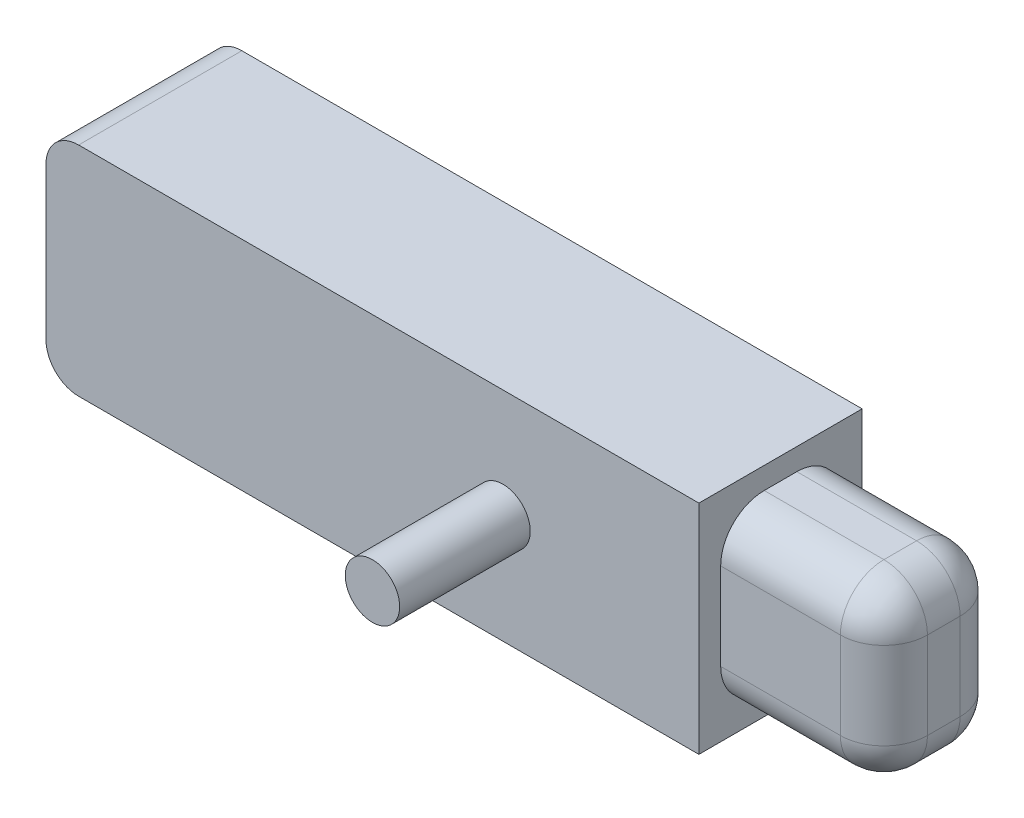
ISO-10303-21;
HEADER;
FILE_DESCRIPTION(('STEP AP214'),'2;1');
FILE_NAME('part.step','',(''),(''),'','','');
FILE_SCHEMA(('AUTOMOTIVE_DESIGN { 1 0 10303 214 1 1 1 1 }'));
ENDSEC;
DATA;
#1=APPLICATION_CONTEXT('core data for automotive mechanical design processes');
#2=APPLICATION_PROTOCOL_DEFINITION('international standard','automotive_design',2000,#1);
#3=PRODUCT_CONTEXT('',#1,'mechanical');
#4=PRODUCT('Part','Part','',(#3));
#5=PRODUCT_RELATED_PRODUCT_CATEGORY('part','',(#4));
#6=PRODUCT_DEFINITION_FORMATION('','',#4);
#7=PRODUCT_DEFINITION_CONTEXT('part definition',#1,'design');
#8=PRODUCT_DEFINITION('design','',#6,#7);
#9=PRODUCT_DEFINITION_SHAPE('','',#8);
#10=(LENGTH_UNIT() NAMED_UNIT(*) SI_UNIT(.MILLI.,.METRE.));
#11=(NAMED_UNIT(*) PLANE_ANGLE_UNIT() SI_UNIT($,.RADIAN.));
#12=(NAMED_UNIT(*) SI_UNIT($,.STERADIAN.) SOLID_ANGLE_UNIT());
#13=UNCERTAINTY_MEASURE_WITH_UNIT(LENGTH_MEASURE(1.E-05),#10,'distance_accuracy_value','');
#14=(GEOMETRIC_REPRESENTATION_CONTEXT(3) GLOBAL_UNCERTAINTY_ASSIGNED_CONTEXT((#13)) GLOBAL_UNIT_ASSIGNED_CONTEXT((#10,
#11,#12)) REPRESENTATION_CONTEXT('',''));
#15=CARTESIAN_POINT('',(0.,0.,0.));
#16=DIRECTION('',(0.,0.,1.));
#17=DIRECTION('',(1.,0.,0.));
#18=AXIS2_PLACEMENT_3D('',#15,#16,#17);
#19=CARTESIAN_POINT('',(30.,20.,7.5));
#20=DIRECTION('',(-1.,0.,0.));
#21=DIRECTION('',(0.,0.,1.));
#22=AXIS2_PLACEMENT_3D('',#19,#20,#21);
#23=PLANE('',#22);
#24=DIRECTION('',(0.,0.,-1.));
#25=VECTOR('',#24,1.);
#26=CARTESIAN_POINT('',(30.,0.,7.5));
#27=LINE('',#26,#25);
#28=CARTESIAN_POINT('',(30.,0.,7.5));
#29=VERTEX_POINT('',#28);
#30=CARTESIAN_POINT('',(30.,0.,-7.5));
#31=VERTEX_POINT('',#30);
#32=EDGE_CURVE('E186',#29,#31,#27,.T.);
#33=ORIENTED_EDGE('',*,*,#32,.T.);
#34=DIRECTION('',(0.,-1.,0.));
#35=VECTOR('',#34,1.);
#36=CARTESIAN_POINT('',(30.,20.,-7.5));
#37=LINE('',#36,#35);
#38=CARTESIAN_POINT('',(30.,20.,-7.5));
#39=VERTEX_POINT('',#38);
#40=EDGE_CURVE('E174',#39,#31,#37,.T.);
#41=ORIENTED_EDGE('',*,*,#40,.F.);
#42=DIRECTION('',(0.,0.,-1.));
#43=VECTOR('',#42,1.);
#44=CARTESIAN_POINT('',(30.,20.,7.5));
#45=LINE('',#44,#43);
#46=CARTESIAN_POINT('',(30.,20.,7.5));
#47=VERTEX_POINT('',#46);
#48=EDGE_CURVE('E160',#47,#39,#45,.T.);
#49=ORIENTED_EDGE('',*,*,#48,.F.);
#50=DIRECTION('',(0.,-1.,0.));
#51=VECTOR('',#50,1.);
#52=CARTESIAN_POINT('',(30.,20.,7.5));
#53=LINE('',#52,#51);
#54=EDGE_CURVE('E168',#47,#29,#53,.T.);
#55=ORIENTED_EDGE('',*,*,#54,.T.);
#56=EDGE_LOOP('',(#33,#41,#49,#55));
#57=FACE_BOUND('',#56,.T.);
#58=DIRECTION('',(0.,-1.,0.));
#59=VECTOR('',#58,1.);
#60=CARTESIAN_POINT('',(30.,2.,5.5));
#61=LINE('',#60,#59);
#62=CARTESIAN_POINT('',(30.,14.,5.5));
#63=VERTEX_POINT('',#62);
#64=CARTESIAN_POINT('',(30.,6.,5.5));
#65=VERTEX_POINT('',#64);
#66=EDGE_CURVE('E273',#63,#65,#61,.T.);
#67=ORIENTED_EDGE('',*,*,#66,.F.);
#68=CARTESIAN_POINT('',(30.,14.,1.5));
#69=DIRECTION('',(-1.,0.,0.));
#70=DIRECTION('',(0.,0.,1.));
#71=AXIS2_PLACEMENT_3D('',#68,#69,#70);
#72=CIRCLE('',#71,4.);
#73=CARTESIAN_POINT('',(30.,18.,1.5));
#74=VERTEX_POINT('',#73);
#75=EDGE_CURVE('E217',#63,#74,#72,.T.);
#76=ORIENTED_EDGE('',*,*,#75,.T.);
#77=DIRECTION('',(0.,0.,1.));
#78=VECTOR('',#77,1.);
#79=CARTESIAN_POINT('',(30.,18.,-5.5));
#80=LINE('',#79,#78);
#81=CARTESIAN_POINT('',(30.,18.,-1.5));
#82=VERTEX_POINT('',#81);
#83=EDGE_CURVE('E586',#82,#74,#80,.T.);
#84=ORIENTED_EDGE('',*,*,#83,.F.);
#85=CARTESIAN_POINT('',(30.,14.,-1.5));
#86=DIRECTION('',(-1.,0.,0.));
#87=DIRECTION('',(0.,0.,1.));
#88=AXIS2_PLACEMENT_3D('',#85,#86,#87);
#89=CIRCLE('',#88,4.);
#90=CARTESIAN_POINT('',(30.,14.,-5.5));
#91=VERTEX_POINT('',#90);
#92=EDGE_CURVE('E219',#82,#91,#89,.T.);
#93=ORIENTED_EDGE('',*,*,#92,.T.);
#94=DIRECTION('',(0.,1.,0.));
#95=VECTOR('',#94,1.);
#96=CARTESIAN_POINT('',(30.,2.,-5.5));
#97=LINE('',#96,#95);
#98=CARTESIAN_POINT('',(30.,6.,-5.5));
#99=VERTEX_POINT('',#98);
#100=EDGE_CURVE('E588',#99,#91,#97,.T.);
#101=ORIENTED_EDGE('',*,*,#100,.F.);
#102=CARTESIAN_POINT('',(30.,6.,-1.5));
#103=DIRECTION('',(-1.,0.,0.));
#104=DIRECTION('',(0.,0.,1.));
#105=AXIS2_PLACEMENT_3D('',#102,#103,#104);
#106=CIRCLE('',#105,4.);
#107=CARTESIAN_POINT('',(30.,2.,-1.5));
#108=VERTEX_POINT('',#107);
#109=EDGE_CURVE('E221',#99,#108,#106,.T.);
#110=ORIENTED_EDGE('',*,*,#109,.T.);
#111=DIRECTION('',(0.,0.,-1.));
#112=VECTOR('',#111,1.);
#113=CARTESIAN_POINT('',(30.,2.,-5.5));
#114=LINE('',#113,#112);
#115=CARTESIAN_POINT('',(30.,2.,1.5));
#116=VERTEX_POINT('',#115);
#117=EDGE_CURVE('E593',#116,#108,#114,.T.);
#118=ORIENTED_EDGE('',*,*,#117,.F.);
#119=CARTESIAN_POINT('',(30.,6.,1.5));
#120=DIRECTION('',(-1.,0.,0.));
#121=DIRECTION('',(0.,0.,1.));
#122=AXIS2_PLACEMENT_3D('',#119,#120,#121);
#123=CIRCLE('',#122,4.);
#124=EDGE_CURVE('E223',#116,#65,#123,.T.);
#125=ORIENTED_EDGE('',*,*,#124,.T.);
#126=EDGE_LOOP('',(#67,#76,#84,#93,#101,#110,#118,#125));
#127=FACE_BOUND('',#126,.T.);
#128=ADVANCED_FACE('F41',(#57,#127),#23,.F.);
#129=CARTESIAN_POINT('',(-30.,20.,7.5));
#130=DIRECTION('',(1.,0.,0.));
#131=DIRECTION('',(0.,0.,-1.));
#132=AXIS2_PLACEMENT_3D('',#129,#130,#131);
#133=PLANE('',#132);
#134=DIRECTION('',(0.,-1.,0.));
#135=VECTOR('',#134,1.);
#136=CARTESIAN_POINT('',(-30.,20.,7.5));
#137=LINE('',#136,#135);
#138=CARTESIAN_POINT('',(-30.,17.,7.5));
#139=VERTEX_POINT('',#138);
#140=CARTESIAN_POINT('',(-30.,3.,7.5));
#141=VERTEX_POINT('',#140);
#142=EDGE_CURVE('E173',#139,#141,#137,.T.);
#143=ORIENTED_EDGE('',*,*,#142,.F.);
#144=DIRECTION('',(0.,0.,1.));
#145=VECTOR('',#144,1.);
#146=CARTESIAN_POINT('',(-30.,17.,-7.5));
#147=LINE('',#146,#145);
#148=CARTESIAN_POINT('',(-30.,17.,-7.5));
#149=VERTEX_POINT('',#148);
#150=EDGE_CURVE('E282',#139,#149,#147,.F.);
#151=ORIENTED_EDGE('',*,*,#150,.T.);
#152=DIRECTION('',(0.,-1.,0.));
#153=VECTOR('',#152,1.);
#154=CARTESIAN_POINT('',(-30.,20.,-7.5));
#155=LINE('',#154,#153);
#156=CARTESIAN_POINT('',(-30.,3.,-7.5));
#157=VERTEX_POINT('',#156);
#158=EDGE_CURVE('E181',#149,#157,#155,.T.);
#159=ORIENTED_EDGE('',*,*,#158,.T.);
#160=DIRECTION('',(0.,0.,1.));
#161=VECTOR('',#160,1.);
#162=CARTESIAN_POINT('',(-30.,3.,7.5));
#163=LINE('',#162,#161);
#164=EDGE_CURVE('E279',#157,#141,#163,.T.);
#165=ORIENTED_EDGE('',*,*,#164,.T.);
#166=EDGE_LOOP('',(#143,#151,#159,#165));
#167=FACE_BOUND('',#166,.T.);
#168=ADVANCED_FACE('F291',(#167),#133,.F.);
#169=CARTESIAN_POINT('',(30.,20.,7.5));
#170=DIRECTION('',(0.,0.,-1.));
#171=DIRECTION('',(-1.,0.,0.));
#172=AXIS2_PLACEMENT_3D('',#169,#170,#171);
#173=PLANE('',#172);
#174=CARTESIAN_POINT('',(12.,10.,7.5));
#175=DIRECTION('',(0.,0.,-1.));
#176=DIRECTION('',(-1.,0.,0.));
#177=AXIS2_PLACEMENT_3D('',#174,#175,#176);
#178=CIRCLE('',#177,2.5);
#179=CARTESIAN_POINT('',(9.5,10.,7.5));
#180=VERTEX_POINT('',#179);
#181=EDGE_CURVE('E194',#180,#180,#178,.F.);
#182=ORIENTED_EDGE('',*,*,#181,.F.);
#183=EDGE_LOOP('',(#182));
#184=FACE_BOUND('',#183,.T.);
#185=DIRECTION('',(1.,0.,0.));
#186=VECTOR('',#185,1.);
#187=CARTESIAN_POINT('',(30.,20.,7.5));
#188=LINE('',#187,#186);
#189=CARTESIAN_POINT('',(-27.,20.,7.5));
#190=VERTEX_POINT('',#189);
#191=EDGE_CURVE('E155',#190,#47,#188,.T.);
#192=ORIENTED_EDGE('',*,*,#191,.F.);
#193=CARTESIAN_POINT('',(-27.,17.,7.5));
#194=DIRECTION('',(0.,0.,-1.));
#195=DIRECTION('',(-1.,0.,0.));
#196=AXIS2_PLACEMENT_3D('',#193,#194,#195);
#197=CIRCLE('',#196,3.);
#198=EDGE_CURVE('E277',#190,#139,#197,.F.);
#199=ORIENTED_EDGE('',*,*,#198,.T.);
#200=ORIENTED_EDGE('',*,*,#142,.T.);
#201=CARTESIAN_POINT('',(-27.,3.,7.5));
#202=DIRECTION('',(0.,0.,-1.));
#203=DIRECTION('',(-1.,0.,0.));
#204=AXIS2_PLACEMENT_3D('',#201,#202,#203);
#205=CIRCLE('',#204,3.);
#206=CARTESIAN_POINT('',(-27.,0.,7.5));
#207=VERTEX_POINT('',#206);
#208=EDGE_CURVE('E275',#141,#207,#205,.F.);
#209=ORIENTED_EDGE('',*,*,#208,.T.);
#210=DIRECTION('',(1.,0.,0.));
#211=VECTOR('',#210,1.);
#212=CARTESIAN_POINT('',(30.,0.,7.5));
#213=LINE('',#212,#211);
#214=EDGE_CURVE('E170',#207,#29,#213,.T.);
#215=ORIENTED_EDGE('',*,*,#214,.T.);
#216=ORIENTED_EDGE('',*,*,#54,.F.);
#217=EDGE_LOOP('',(#192,#199,#200,#209,#215,#216));
#218=FACE_BOUND('',#217,.T.);
#219=ADVANCED_FACE('F169',(#184,#218),#173,.F.);
#220=CARTESIAN_POINT('',(30.,20.,-7.5));
#221=DIRECTION('',(0.,0.,1.));
#222=DIRECTION('',(1.,0.,0.));
#223=AXIS2_PLACEMENT_3D('',#220,#221,#222);
#224=PLANE('',#223);
#225=ORIENTED_EDGE('',*,*,#158,.F.);
#226=CARTESIAN_POINT('',(-27.,17.,-7.5));
#227=DIRECTION('',(0.,0.,1.));
#228=DIRECTION('',(1.,0.,0.));
#229=AXIS2_PLACEMENT_3D('',#226,#227,#228);
#230=CIRCLE('',#229,3.);
#231=CARTESIAN_POINT('',(-27.,20.,-7.5));
#232=VERTEX_POINT('',#231);
#233=EDGE_CURVE('E49',#149,#232,#230,.F.);
#234=ORIENTED_EDGE('',*,*,#233,.T.);
#235=DIRECTION('',(-1.,0.,0.));
#236=VECTOR('',#235,1.);
#237=CARTESIAN_POINT('',(30.,20.,-7.5));
#238=LINE('',#237,#236);
#239=EDGE_CURVE('E179',#39,#232,#238,.T.);
#240=ORIENTED_EDGE('',*,*,#239,.F.);
#241=ORIENTED_EDGE('',*,*,#40,.T.);
#242=DIRECTION('',(-1.,0.,0.));
#243=VECTOR('',#242,1.);
#244=CARTESIAN_POINT('',(30.,0.,-7.5));
#245=LINE('',#244,#243);
#246=CARTESIAN_POINT('',(-27.,0.,-7.5));
#247=VERTEX_POINT('',#246);
#248=EDGE_CURVE('E165',#31,#247,#245,.T.);
#249=ORIENTED_EDGE('',*,*,#248,.T.);
#250=CARTESIAN_POINT('',(-27.,3.,-7.5));
#251=DIRECTION('',(0.,0.,1.));
#252=DIRECTION('',(1.,0.,0.));
#253=AXIS2_PLACEMENT_3D('',#250,#251,#252);
#254=CIRCLE('',#253,3.);
#255=EDGE_CURVE('E61',#247,#157,#254,.F.);
#256=ORIENTED_EDGE('',*,*,#255,.T.);
#257=EDGE_LOOP('',(#225,#234,#240,#241,#249,#256));
#258=FACE_BOUND('',#257,.T.);
#259=ADVANCED_FACE('F285',(#258),#224,.F.);
#260=CARTESIAN_POINT('',(0.,20.,0.));
#261=DIRECTION('',(0.,1.,0.));
#262=DIRECTION('',(0.,0.,1.));
#263=AXIS2_PLACEMENT_3D('',#260,#261,#262);
#264=PLANE('',#263);
#265=ORIENTED_EDGE('',*,*,#239,.T.);
#266=DIRECTION('',(0.,0.,1.));
#267=VECTOR('',#266,1.);
#268=CARTESIAN_POINT('',(-27.,20.,7.5));
#269=LINE('',#268,#267);
#270=EDGE_CURVE('E163',#232,#190,#269,.T.);
#271=ORIENTED_EDGE('',*,*,#270,.T.);
#272=ORIENTED_EDGE('',*,*,#191,.T.);
#273=ORIENTED_EDGE('',*,*,#48,.T.);
#274=EDGE_LOOP('',(#265,#271,#272,#273));
#275=FACE_BOUND('',#274,.T.);
#276=ADVANCED_FACE('F158',(#275),#264,.T.);
#277=CARTESIAN_POINT('',(0.,0.,0.));
#278=DIRECTION('',(0.,1.,0.));
#279=DIRECTION('',(0.,0.,1.));
#280=AXIS2_PLACEMENT_3D('',#277,#278,#279);
#281=PLANE('',#280);
#282=ORIENTED_EDGE('',*,*,#214,.F.);
#283=DIRECTION('',(0.,0.,1.));
#284=VECTOR('',#283,1.);
#285=CARTESIAN_POINT('',(-27.,0.,0.));
#286=LINE('',#285,#284);
#287=EDGE_CURVE('E11',#207,#247,#286,.F.);
#288=ORIENTED_EDGE('',*,*,#287,.T.);
#289=ORIENTED_EDGE('',*,*,#248,.F.);
#290=ORIENTED_EDGE('',*,*,#32,.F.);
#291=EDGE_LOOP('',(#282,#288,#289,#290));
#292=FACE_BOUND('',#291,.T.);
#293=ADVANCED_FACE('F294',(#292),#281,.F.);
#294=CARTESIAN_POINT('',(12.,10.,19.5));
#295=DIRECTION('',(0.,0.,-1.));
#296=DIRECTION('',(-1.,0.,0.));
#297=AXIS2_PLACEMENT_3D('',#294,#295,#296);
#298=CYLINDRICAL_SURFACE('',#297,2.5);
#299=CARTESIAN_POINT('',(12.,10.,19.5));
#300=DIRECTION('',(0.,0.,1.));
#301=DIRECTION('',(1.,0.,0.));
#302=AXIS2_PLACEMENT_3D('',#299,#300,#301);
#303=CIRCLE('',#302,2.5);
#304=CARTESIAN_POINT('',(14.5,10.,19.5));
#305=VERTEX_POINT('',#304);
#306=EDGE_CURVE('E187',#305,#305,#303,.T.);
#307=ORIENTED_EDGE('',*,*,#306,.F.);
#308=EDGE_LOOP('',(#307));
#309=FACE_BOUND('',#308,.T.);
#310=ORIENTED_EDGE('',*,*,#181,.T.);
#311=EDGE_LOOP('',(#310));
#312=FACE_BOUND('',#311,.T.);
#313=ADVANCED_FACE('F296',(#309,#312),#298,.T.);
#314=CARTESIAN_POINT('',(12.,10.,19.5));
#315=DIRECTION('',(0.,0.,1.));
#316=DIRECTION('',(1.,0.,0.));
#317=AXIS2_PLACEMENT_3D('',#314,#315,#316);
#318=PLANE('',#317);
#319=ORIENTED_EDGE('',*,*,#306,.T.);
#320=EDGE_LOOP('',(#319));
#321=FACE_BOUND('',#320,.T.);
#322=ADVANCED_FACE('F302',(#321),#318,.T.);
#323=CARTESIAN_POINT('',(45.,2.,5.5));
#324=DIRECTION('',(0.,0.,-1.));
#325=DIRECTION('',(-1.,0.,0.));
#326=AXIS2_PLACEMENT_3D('',#323,#324,#325);
#327=PLANE('',#326);
#328=DIRECTION('',(-1.,0.,0.));
#329=VECTOR('',#328,1.);
#330=CARTESIAN_POINT('',(45.,6.,5.5));
#331=LINE('',#330,#329);
#332=CARTESIAN_POINT('',(41.,6.,5.5));
#333=VERTEX_POINT('',#332);
#334=EDGE_CURVE('E197',#65,#333,#331,.F.);
#335=ORIENTED_EDGE('',*,*,#334,.T.);
#336=DIRECTION('',(0.,-1.,0.));
#337=VECTOR('',#336,1.);
#338=CARTESIAN_POINT('',(41.,14.,5.5));
#339=LINE('',#338,#337);
#340=CARTESIAN_POINT('',(41.,14.,5.5));
#341=VERTEX_POINT('',#340);
#342=EDGE_CURVE('E243',#333,#341,#339,.F.);
#343=ORIENTED_EDGE('',*,*,#342,.T.);
#344=DIRECTION('',(-1.,0.,0.));
#345=VECTOR('',#344,1.);
#346=CARTESIAN_POINT('',(45.,14.,5.5));
#347=LINE('',#346,#345);
#348=EDGE_CURVE('E200',#341,#63,#347,.T.);
#349=ORIENTED_EDGE('',*,*,#348,.T.);
#350=ORIENTED_EDGE('',*,*,#66,.T.);
#351=EDGE_LOOP('',(#335,#343,#349,#350));
#352=FACE_BOUND('',#351,.T.);
#353=ADVANCED_FACE('F539',(#352),#327,.F.);
#354=CARTESIAN_POINT('',(45.,2.,-5.5));
#355=DIRECTION('',(0.,1.,0.));
#356=DIRECTION('',(0.,0.,1.));
#357=AXIS2_PLACEMENT_3D('',#354,#355,#356);
#358=PLANE('',#357);
#359=DIRECTION('',(-1.,0.,0.));
#360=VECTOR('',#359,1.);
#361=CARTESIAN_POINT('',(45.,2.,-1.5));
#362=LINE('',#361,#360);
#363=CARTESIAN_POINT('',(41.,2.,-1.5));
#364=VERTEX_POINT('',#363);
#365=EDGE_CURVE('E214',#108,#364,#362,.F.);
#366=ORIENTED_EDGE('',*,*,#365,.T.);
#367=DIRECTION('',(0.,0.,-1.));
#368=VECTOR('',#367,1.);
#369=CARTESIAN_POINT('',(41.,2.,1.5));
#370=LINE('',#369,#368);
#371=CARTESIAN_POINT('',(41.,2.,1.5));
#372=VERTEX_POINT('',#371);
#373=EDGE_CURVE('E239',#364,#372,#370,.F.);
#374=ORIENTED_EDGE('',*,*,#373,.T.);
#375=DIRECTION('',(-1.,0.,0.));
#376=VECTOR('',#375,1.);
#377=CARTESIAN_POINT('',(45.,2.,1.5));
#378=LINE('',#377,#376);
#379=EDGE_CURVE('E212',#372,#116,#378,.T.);
#380=ORIENTED_EDGE('',*,*,#379,.T.);
#381=ORIENTED_EDGE('',*,*,#117,.T.);
#382=EDGE_LOOP('',(#366,#374,#380,#381));
#383=FACE_BOUND('',#382,.T.);
#384=ADVANCED_FACE('F528',(#383),#358,.F.);
#385=CARTESIAN_POINT('',(45.,2.,-5.5));
#386=DIRECTION('',(0.,0.,1.));
#387=DIRECTION('',(1.,0.,0.));
#388=AXIS2_PLACEMENT_3D('',#385,#386,#387);
#389=PLANE('',#388);
#390=DIRECTION('',(-1.,0.,0.));
#391=VECTOR('',#390,1.);
#392=CARTESIAN_POINT('',(45.,14.,-5.5));
#393=LINE('',#392,#391);
#394=CARTESIAN_POINT('',(41.,14.,-5.5));
#395=VERTEX_POINT('',#394);
#396=EDGE_CURVE('E209',#91,#395,#393,.F.);
#397=ORIENTED_EDGE('',*,*,#396,.T.);
#398=DIRECTION('',(0.,1.,0.));
#399=VECTOR('',#398,1.);
#400=CARTESIAN_POINT('',(41.,6.,-5.5));
#401=LINE('',#400,#399);
#402=CARTESIAN_POINT('',(41.,6.,-5.5));
#403=VERTEX_POINT('',#402);
#404=EDGE_CURVE('E234',#395,#403,#401,.F.);
#405=ORIENTED_EDGE('',*,*,#404,.T.);
#406=DIRECTION('',(-1.,0.,0.));
#407=VECTOR('',#406,1.);
#408=CARTESIAN_POINT('',(45.,6.,-5.5));
#409=LINE('',#408,#407);
#410=EDGE_CURVE('E207',#403,#99,#409,.T.);
#411=ORIENTED_EDGE('',*,*,#410,.T.);
#412=ORIENTED_EDGE('',*,*,#100,.T.);
#413=EDGE_LOOP('',(#397,#405,#411,#412));
#414=FACE_BOUND('',#413,.T.);
#415=ADVANCED_FACE('F517',(#414),#389,.F.);
#416=CARTESIAN_POINT('',(45.,18.,-5.5));
#417=DIRECTION('',(0.,-1.,0.));
#418=DIRECTION('',(0.,0.,-1.));
#419=AXIS2_PLACEMENT_3D('',#416,#417,#418);
#420=PLANE('',#419);
#421=DIRECTION('',(-1.,0.,0.));
#422=VECTOR('',#421,1.);
#423=CARTESIAN_POINT('',(45.,18.,1.5));
#424=LINE('',#423,#422);
#425=CARTESIAN_POINT('',(41.,18.,1.5));
#426=VERTEX_POINT('',#425);
#427=EDGE_CURVE('E204',#74,#426,#424,.F.);
#428=ORIENTED_EDGE('',*,*,#427,.T.);
#429=DIRECTION('',(0.,0.,1.));
#430=VECTOR('',#429,1.);
#431=CARTESIAN_POINT('',(41.,18.,-1.5));
#432=LINE('',#431,#430);
#433=CARTESIAN_POINT('',(41.,18.,-1.5));
#434=VERTEX_POINT('',#433);
#435=EDGE_CURVE('E247',#426,#434,#432,.F.);
#436=ORIENTED_EDGE('',*,*,#435,.T.);
#437=DIRECTION('',(-1.,0.,0.));
#438=VECTOR('',#437,1.);
#439=CARTESIAN_POINT('',(45.,18.,-1.5));
#440=LINE('',#439,#438);
#441=EDGE_CURVE('E202',#434,#82,#440,.T.);
#442=ORIENTED_EDGE('',*,*,#441,.T.);
#443=ORIENTED_EDGE('',*,*,#83,.T.);
#444=EDGE_LOOP('',(#428,#436,#442,#443));
#445=FACE_BOUND('',#444,.T.);
#446=ADVANCED_FACE('F506',(#445),#420,.F.);
#447=CARTESIAN_POINT('',(45.,0.,0.));
#448=DIRECTION('',(1.,0.,0.));
#449=DIRECTION('',(0.,0.,-1.));
#450=AXIS2_PLACEMENT_3D('',#447,#448,#449);
#451=PLANE('',#450);
#452=DIRECTION('',(0.,0.,-1.));
#453=VECTOR('',#452,1.);
#454=CARTESIAN_POINT('',(45.,6.,-1.5));
#455=LINE('',#454,#453);
#456=CARTESIAN_POINT('',(45.,6.,1.5));
#457=VERTEX_POINT('',#456);
#458=CARTESIAN_POINT('',(45.,6.,-1.5));
#459=VERTEX_POINT('',#458);
#460=EDGE_CURVE('E229',#457,#459,#455,.T.);
#461=ORIENTED_EDGE('',*,*,#460,.T.);
#462=DIRECTION('',(0.,1.,0.));
#463=VECTOR('',#462,1.);
#464=CARTESIAN_POINT('',(45.,14.,-1.5));
#465=LINE('',#464,#463);
#466=CARTESIAN_POINT('',(45.,14.,-1.5));
#467=VERTEX_POINT('',#466);
#468=EDGE_CURVE('E231',#459,#467,#465,.T.);
#469=ORIENTED_EDGE('',*,*,#468,.T.);
#470=DIRECTION('',(0.,0.,1.));
#471=VECTOR('',#470,1.);
#472=CARTESIAN_POINT('',(45.,14.,1.5));
#473=LINE('',#472,#471);
#474=CARTESIAN_POINT('',(45.,14.,1.5));
#475=VERTEX_POINT('',#474);
#476=EDGE_CURVE('E225',#467,#475,#473,.T.);
#477=ORIENTED_EDGE('',*,*,#476,.T.);
#478=DIRECTION('',(0.,-1.,0.));
#479=VECTOR('',#478,1.);
#480=CARTESIAN_POINT('',(45.,6.,1.5));
#481=LINE('',#480,#479);
#482=EDGE_CURVE('E227',#475,#457,#481,.T.);
#483=ORIENTED_EDGE('',*,*,#482,.T.);
#484=EDGE_LOOP('',(#461,#469,#477,#483));
#485=FACE_BOUND('',#484,.T.);
#486=ADVANCED_FACE('F321',(#485),#451,.T.);
#487=CARTESIAN_POINT('',(45.,14.,1.5));
#488=DIRECTION('',(-1.,0.,0.));
#489=DIRECTION('',(0.,0.,1.));
#490=AXIS2_PLACEMENT_3D('',#487,#488,#489);
#491=CYLINDRICAL_SURFACE('',#490,4.);
#492=ORIENTED_EDGE('',*,*,#348,.F.);
#493=CARTESIAN_POINT('',(41.,14.,1.5));
#494=DIRECTION('',(-1.,0.,0.));
#495=DIRECTION('',(0.,0.,1.));
#496=AXIS2_PLACEMENT_3D('',#493,#494,#495);
#497=CIRCLE('',#496,4.);
#498=EDGE_CURVE('E245',#341,#426,#497,.T.);
#499=ORIENTED_EDGE('',*,*,#498,.T.);
#500=ORIENTED_EDGE('',*,*,#427,.F.);
#501=ORIENTED_EDGE('',*,*,#75,.F.);
#502=EDGE_LOOP('',(#492,#499,#500,#501));
#503=FACE_BOUND('',#502,.T.);
#504=ADVANCED_FACE('F317',(#503),#491,.T.);
#505=CARTESIAN_POINT('',(45.,14.,-1.5));
#506=DIRECTION('',(-1.,0.,0.));
#507=DIRECTION('',(0.,0.,1.));
#508=AXIS2_PLACEMENT_3D('',#505,#506,#507);
#509=CYLINDRICAL_SURFACE('',#508,4.);
#510=ORIENTED_EDGE('',*,*,#441,.F.);
#511=CARTESIAN_POINT('',(41.,14.,-1.5));
#512=DIRECTION('',(-1.,0.,0.));
#513=DIRECTION('',(0.,0.,1.));
#514=AXIS2_PLACEMENT_3D('',#511,#512,#513);
#515=CIRCLE('',#514,4.);
#516=EDGE_CURVE('E249',#434,#395,#515,.T.);
#517=ORIENTED_EDGE('',*,*,#516,.T.);
#518=ORIENTED_EDGE('',*,*,#396,.F.);
#519=ORIENTED_EDGE('',*,*,#92,.F.);
#520=EDGE_LOOP('',(#510,#517,#518,#519));
#521=FACE_BOUND('',#520,.T.);
#522=ADVANCED_FACE('F320',(#521),#509,.T.);
#523=CARTESIAN_POINT('',(45.,6.,-1.5));
#524=DIRECTION('',(-1.,0.,0.));
#525=DIRECTION('',(0.,0.,1.));
#526=AXIS2_PLACEMENT_3D('',#523,#524,#525);
#527=CYLINDRICAL_SURFACE('',#526,4.);
#528=ORIENTED_EDGE('',*,*,#410,.F.);
#529=CARTESIAN_POINT('',(41.,6.,-1.5));
#530=DIRECTION('',(-1.,0.,0.));
#531=DIRECTION('',(0.,0.,1.));
#532=AXIS2_PLACEMENT_3D('',#529,#530,#531);
#533=CIRCLE('',#532,4.);
#534=EDGE_CURVE('E237',#403,#364,#533,.T.);
#535=ORIENTED_EDGE('',*,*,#534,.T.);
#536=ORIENTED_EDGE('',*,*,#365,.F.);
#537=ORIENTED_EDGE('',*,*,#109,.F.);
#538=EDGE_LOOP('',(#528,#535,#536,#537));
#539=FACE_BOUND('',#538,.T.);
#540=ADVANCED_FACE('F325',(#539),#527,.T.);
#541=CARTESIAN_POINT('',(45.,6.,1.5));
#542=DIRECTION('',(-1.,0.,0.));
#543=DIRECTION('',(0.,0.,1.));
#544=AXIS2_PLACEMENT_3D('',#541,#542,#543);
#545=CYLINDRICAL_SURFACE('',#544,4.);
#546=ORIENTED_EDGE('',*,*,#379,.F.);
#547=CARTESIAN_POINT('',(41.,6.,1.5));
#548=DIRECTION('',(-1.,0.,0.));
#549=DIRECTION('',(0.,0.,1.));
#550=AXIS2_PLACEMENT_3D('',#547,#548,#549);
#551=CIRCLE('',#550,4.);
#552=EDGE_CURVE('E241',#372,#333,#551,.T.);
#553=ORIENTED_EDGE('',*,*,#552,.T.);
#554=ORIENTED_EDGE('',*,*,#334,.F.);
#555=ORIENTED_EDGE('',*,*,#124,.F.);
#556=EDGE_LOOP('',(#546,#553,#554,#555));
#557=FACE_BOUND('',#556,.T.);
#558=ADVANCED_FACE('F329',(#557),#545,.T.);
#559=CARTESIAN_POINT('',(41.,0.,1.5));
#560=DIRECTION('',(0.,1.,0.));
#561=DIRECTION('',(0.,0.,1.));
#562=AXIS2_PLACEMENT_3D('',#559,#560,#561);
#563=CYLINDRICAL_SURFACE('',#562,4.);
#564=CARTESIAN_POINT('',(41.,14.,1.5));
#565=DIRECTION('',(0.,1.,0.));
#566=DIRECTION('',(0.,0.,1.));
#567=AXIS2_PLACEMENT_3D('',#564,#565,#566);
#568=CIRCLE('',#567,4.);
#569=EDGE_CURVE('E267',#341,#475,#568,.T.);
#570=ORIENTED_EDGE('',*,*,#569,.F.);
#571=ORIENTED_EDGE('',*,*,#342,.F.);
#572=CARTESIAN_POINT('',(41.,6.,1.5));
#573=DIRECTION('',(0.,-1.,0.));
#574=DIRECTION('',(0.,0.,-1.));
#575=AXIS2_PLACEMENT_3D('',#572,#573,#574);
#576=CIRCLE('',#575,4.);
#577=EDGE_CURVE('E270',#457,#333,#576,.T.);
#578=ORIENTED_EDGE('',*,*,#577,.F.);
#579=ORIENTED_EDGE('',*,*,#482,.F.);
#580=EDGE_LOOP('',(#570,#571,#578,#579));
#581=FACE_BOUND('',#580,.T.);
#582=ADVANCED_FACE('F333',(#581),#563,.T.);
#583=CARTESIAN_POINT('',(41.,6.,1.5));
#584=DIRECTION('',(1.,0.,0.));
#585=DIRECTION('',(0.,0.,-1.));
#586=AXIS2_PLACEMENT_3D('',#583,#584,#585);
#587=SPHERICAL_SURFACE('',#586,4.);
#588=ORIENTED_EDGE('',*,*,#577,.T.);
#589=ORIENTED_EDGE('',*,*,#552,.F.);
#590=CARTESIAN_POINT('',(41.,6.,1.5));
#591=DIRECTION('',(0.,0.,-1.));
#592=DIRECTION('',(-1.,0.,0.));
#593=AXIS2_PLACEMENT_3D('',#590,#591,#592);
#594=CIRCLE('',#593,4.);
#595=EDGE_CURVE('E264',#457,#372,#594,.T.);
#596=ORIENTED_EDGE('',*,*,#595,.F.);
#597=EDGE_LOOP('',(#588,#589,#596));
#598=FACE_BOUND('',#597,.T.);
#599=ADVANCED_FACE('F358',(#598),#587,.T.);
#600=CARTESIAN_POINT('',(41.,14.,1.5));
#601=DIRECTION('',(1.,0.,0.));
#602=DIRECTION('',(0.,0.,-1.));
#603=AXIS2_PLACEMENT_3D('',#600,#601,#602);
#604=SPHERICAL_SURFACE('',#603,4.);
#605=ORIENTED_EDGE('',*,*,#498,.F.);
#606=ORIENTED_EDGE('',*,*,#569,.T.);
#607=CARTESIAN_POINT('',(41.,14.,1.5));
#608=DIRECTION('',(0.,0.,-1.));
#609=DIRECTION('',(-1.,0.,0.));
#610=AXIS2_PLACEMENT_3D('',#607,#608,#609);
#611=CIRCLE('',#610,4.);
#612=EDGE_CURVE('E261',#426,#475,#611,.T.);
#613=ORIENTED_EDGE('',*,*,#612,.F.);
#614=EDGE_LOOP('',(#605,#606,#613));
#615=FACE_BOUND('',#614,.T.);
#616=ADVANCED_FACE('F354',(#615),#604,.T.);
#617=CARTESIAN_POINT('',(41.,6.,0.));
#618=DIRECTION('',(0.,0.,1.));
#619=DIRECTION('',(0.,-1.,0.));
#620=AXIS2_PLACEMENT_3D('',#617,#618,#619);
#621=CYLINDRICAL_SURFACE('',#620,4.);
#622=ORIENTED_EDGE('',*,*,#595,.T.);
#623=ORIENTED_EDGE('',*,*,#373,.F.);
#624=CARTESIAN_POINT('',(41.,6.,-1.5));
#625=DIRECTION('',(0.,0.,-1.));
#626=DIRECTION('',(-1.,0.,0.));
#627=AXIS2_PLACEMENT_3D('',#624,#625,#626);
#628=CIRCLE('',#627,4.);
#629=EDGE_CURVE('E258',#459,#364,#628,.T.);
#630=ORIENTED_EDGE('',*,*,#629,.F.);
#631=ORIENTED_EDGE('',*,*,#460,.F.);
#632=EDGE_LOOP('',(#622,#623,#630,#631));
#633=FACE_BOUND('',#632,.T.);
#634=ADVANCED_FACE('F350',(#633),#621,.T.);
#635=CARTESIAN_POINT('',(41.,14.,0.));
#636=DIRECTION('',(0.,0.,-1.));
#637=DIRECTION('',(-1.,0.,0.));
#638=AXIS2_PLACEMENT_3D('',#635,#636,#637);
#639=CYLINDRICAL_SURFACE('',#638,4.);
#640=ORIENTED_EDGE('',*,*,#612,.T.);
#641=ORIENTED_EDGE('',*,*,#476,.F.);
#642=CARTESIAN_POINT('',(41.,14.,-1.5));
#643=DIRECTION('',(0.,0.,-1.));
#644=DIRECTION('',(-1.,0.,0.));
#645=AXIS2_PLACEMENT_3D('',#642,#643,#644);
#646=CIRCLE('',#645,4.);
#647=EDGE_CURVE('E255',#434,#467,#646,.T.);
#648=ORIENTED_EDGE('',*,*,#647,.F.);
#649=ORIENTED_EDGE('',*,*,#435,.F.);
#650=EDGE_LOOP('',(#640,#641,#648,#649));
#651=FACE_BOUND('',#650,.T.);
#652=ADVANCED_FACE('F346',(#651),#639,.T.);
#653=CARTESIAN_POINT('',(41.,6.,-1.5));
#654=DIRECTION('',(1.,0.,0.));
#655=DIRECTION('',(0.,0.,-1.));
#656=AXIS2_PLACEMENT_3D('',#653,#654,#655);
#657=SPHERICAL_SURFACE('',#656,4.);
#658=ORIENTED_EDGE('',*,*,#629,.T.);
#659=ORIENTED_EDGE('',*,*,#534,.F.);
#660=CARTESIAN_POINT('',(41.,6.,-1.5));
#661=DIRECTION('',(0.,1.,0.));
#662=DIRECTION('',(0.,0.,1.));
#663=AXIS2_PLACEMENT_3D('',#660,#661,#662);
#664=CIRCLE('',#663,4.);
#665=EDGE_CURVE('E253',#459,#403,#664,.T.);
#666=ORIENTED_EDGE('',*,*,#665,.F.);
#667=EDGE_LOOP('',(#658,#659,#666));
#668=FACE_BOUND('',#667,.T.);
#669=ADVANCED_FACE('F342',(#668),#657,.T.);
#670=CARTESIAN_POINT('',(41.,14.,-1.5));
#671=DIRECTION('',(1.,0.,0.));
#672=DIRECTION('',(0.,0.,-1.));
#673=AXIS2_PLACEMENT_3D('',#670,#671,#672);
#674=SPHERICAL_SURFACE('',#673,4.);
#675=ORIENTED_EDGE('',*,*,#516,.F.);
#676=ORIENTED_EDGE('',*,*,#647,.T.);
#677=CARTESIAN_POINT('',(41.,14.,-1.5));
#678=DIRECTION('',(0.,-1.,0.));
#679=DIRECTION('',(0.,0.,-1.));
#680=AXIS2_PLACEMENT_3D('',#677,#678,#679);
#681=CIRCLE('',#680,4.);
#682=EDGE_CURVE('E251',#395,#467,#681,.T.);
#683=ORIENTED_EDGE('',*,*,#682,.F.);
#684=EDGE_LOOP('',(#675,#676,#683));
#685=FACE_BOUND('',#684,.T.);
#686=ADVANCED_FACE('F338',(#685),#674,.T.);
#687=CARTESIAN_POINT('',(41.,0.,-1.5));
#688=DIRECTION('',(0.,-1.,0.));
#689=DIRECTION('',(0.,0.,-1.));
#690=AXIS2_PLACEMENT_3D('',#687,#688,#689);
#691=CYLINDRICAL_SURFACE('',#690,4.);
#692=ORIENTED_EDGE('',*,*,#665,.T.);
#693=ORIENTED_EDGE('',*,*,#404,.F.);
#694=ORIENTED_EDGE('',*,*,#682,.T.);
#695=ORIENTED_EDGE('',*,*,#468,.F.);
#696=EDGE_LOOP('',(#692,#693,#694,#695));
#697=FACE_BOUND('',#696,.T.);
#698=ADVANCED_FACE('F335',(#697),#691,.T.);
#699=CARTESIAN_POINT('',(-27.,17.,0.));
#700=DIRECTION('',(0.,0.,-1.));
#701=DIRECTION('',(-1.,0.,0.));
#702=AXIS2_PLACEMENT_3D('',#699,#700,#701);
#703=CYLINDRICAL_SURFACE('',#702,3.);
#704=ORIENTED_EDGE('',*,*,#233,.F.);
#705=ORIENTED_EDGE('',*,*,#150,.F.);
#706=ORIENTED_EDGE('',*,*,#198,.F.);
#707=ORIENTED_EDGE('',*,*,#270,.F.);
#708=EDGE_LOOP('',(#704,#705,#706,#707));
#709=FACE_BOUND('',#708,.T.);
#710=ADVANCED_FACE('F288',(#709),#703,.T.);
#711=CARTESIAN_POINT('',(-27.,3.,7.5));
#712=DIRECTION('',(0.,0.,1.));
#713=DIRECTION('',(1.,0.,0.));
#714=AXIS2_PLACEMENT_3D('',#711,#712,#713);
#715=CYLINDRICAL_SURFACE('',#714,3.);
#716=ORIENTED_EDGE('',*,*,#255,.F.);
#717=ORIENTED_EDGE('',*,*,#287,.F.);
#718=ORIENTED_EDGE('',*,*,#208,.F.);
#719=ORIENTED_EDGE('',*,*,#164,.F.);
#720=EDGE_LOOP('',(#716,#717,#718,#719));
#721=FACE_BOUND('',#720,.T.);
#722=ADVANCED_FACE('F43',(#721),#715,.T.);
#723=CLOSED_SHELL('',(#128,#168,#219,#259,#276,#293,#313,#322,#353,#384,#415,#446,#486,#504,
#522,#540,#558,#582,#599,#616,#634,#652,#669,#686,#698,#710,#722));
#724=MANIFOLD_SOLID_BREP('B2',#723);
#725=ADVANCED_BREP_SHAPE_REPRESENTATION('',(#18,#724),#14);
#726=SHAPE_DEFINITION_REPRESENTATION(#9,#725);
ENDSEC;
END-ISO-10303-21;
